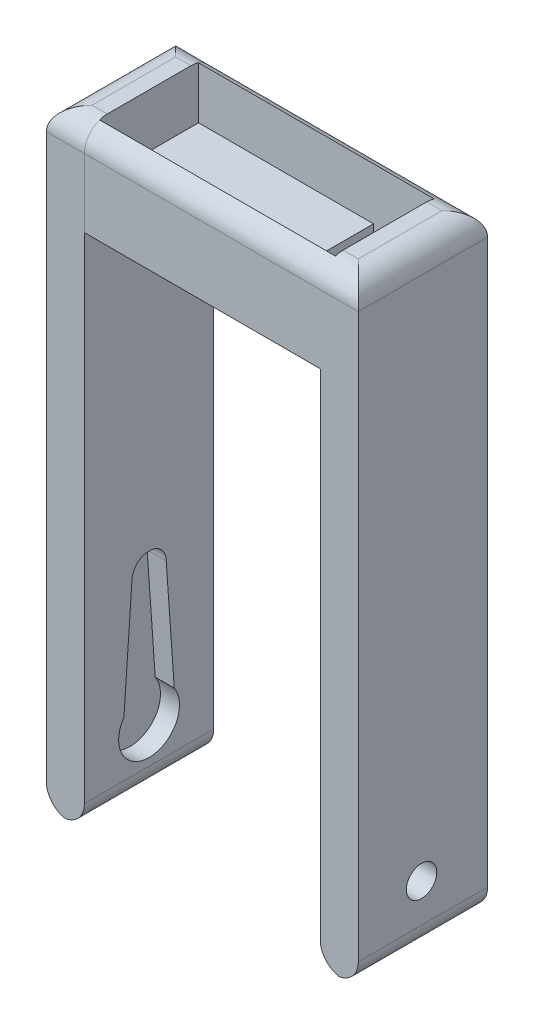
ISO-10303-21;
HEADER;
FILE_DESCRIPTION(('STEP AP214'),'2;1');
FILE_NAME('part.step','',(''),(''),'','','');
FILE_SCHEMA(('AUTOMOTIVE_DESIGN { 1 0 10303 214 1 1 1 1 }'));
ENDSEC;
DATA;
#1=APPLICATION_CONTEXT('core data for automotive mechanical design processes');
#2=APPLICATION_PROTOCOL_DEFINITION('international standard','automotive_design',2000,#1);
#3=PRODUCT_CONTEXT('',#1,'mechanical');
#4=PRODUCT('Part','Part','',(#3));
#5=PRODUCT_RELATED_PRODUCT_CATEGORY('part','',(#4));
#6=PRODUCT_DEFINITION_FORMATION('','',#4);
#7=PRODUCT_DEFINITION_CONTEXT('part definition',#1,'design');
#8=PRODUCT_DEFINITION('design','',#6,#7);
#9=PRODUCT_DEFINITION_SHAPE('','',#8);
#10=(LENGTH_UNIT() NAMED_UNIT(*) SI_UNIT(.MILLI.,.METRE.));
#11=(NAMED_UNIT(*) PLANE_ANGLE_UNIT() SI_UNIT($,.RADIAN.));
#12=(NAMED_UNIT(*) SI_UNIT($,.STERADIAN.) SOLID_ANGLE_UNIT());
#13=UNCERTAINTY_MEASURE_WITH_UNIT(LENGTH_MEASURE(1.E-05),#10,'distance_accuracy_value','');
#14=(GEOMETRIC_REPRESENTATION_CONTEXT(3) GLOBAL_UNCERTAINTY_ASSIGNED_CONTEXT((#13)) GLOBAL_UNIT_ASSIGNED_CONTEXT((#10,
#11,#12)) REPRESENTATION_CONTEXT('',''));
#15=CARTESIAN_POINT('',(0.,0.,0.));
#16=DIRECTION('',(0.,0.,1.));
#17=DIRECTION('',(1.,0.,0.));
#18=AXIS2_PLACEMENT_3D('',#15,#16,#17);
#19=CARTESIAN_POINT('',(-0.00200000000000894,73.,2.));
#20=DIRECTION('',(0.,-1.,0.));
#21=DIRECTION('',(0.,0.,-1.));
#22=AXIS2_PLACEMENT_3D('',#19,#20,#21);
#23=PLANE('',#22);
#24=DIRECTION('',(1.,0.,0.));
#25=VECTOR('',#24,1.);
#26=CARTESIAN_POINT('',(-0.00200000000000894,73.,2.));
#27=LINE('',#26,#25);
#28=CARTESIAN_POINT('',(31.,73.,1.99999999999999));
#29=VERTEX_POINT('',#28);
#30=CARTESIAN_POINT('',(36.,73.,1.99999999999998));
#31=VERTEX_POINT('',#30);
#32=EDGE_CURVE('E228',#29,#31,#27,.T.);
#33=ORIENTED_EDGE('',*,*,#32,.F.);
#34=DIRECTION('',(0.,0.,-1.));
#35=VECTOR('',#34,1.);
#36=CARTESIAN_POINT('',(31.,73.,15.));
#37=LINE('',#36,#35);
#38=CARTESIAN_POINT('',(31.,73.,15.));
#39=VERTEX_POINT('',#38);
#40=EDGE_CURVE('E186',#39,#29,#37,.T.);
#41=ORIENTED_EDGE('',*,*,#40,.F.);
#42=DIRECTION('',(1.,0.,0.));
#43=VECTOR('',#42,1.);
#44=CARTESIAN_POINT('',(-0.002000000000002,73.,15.));
#45=LINE('',#44,#43);
#46=CARTESIAN_POINT('',(36.,73.,15.));
#47=VERTEX_POINT('',#46);
#48=EDGE_CURVE('E231',#39,#47,#45,.T.);
#49=ORIENTED_EDGE('',*,*,#48,.T.);
#50=DIRECTION('',(0.,0.,-1.));
#51=VECTOR('',#50,1.);
#52=CARTESIAN_POINT('',(36.,73.,1.99999999999998));
#53=LINE('',#52,#51);
#54=EDGE_CURVE('E223',#47,#31,#53,.T.);
#55=ORIENTED_EDGE('',*,*,#54,.T.);
#56=EDGE_LOOP('',(#33,#41,#49,#55));
#57=FACE_BOUND('',#56,.T.);
#58=ADVANCED_FACE('F46',(#57),#23,.F.);
#59=CARTESIAN_POINT('',(36.,80.,0.));
#60=DIRECTION('',(1.,0.,0.));
#61=DIRECTION('',(0.,0.,-1.));
#62=AXIS2_PLACEMENT_3D('',#59,#60,#61);
#63=PLANE('',#62);
#64=DIRECTION('',(0.,-1.,0.));
#65=VECTOR('',#64,1.);
#66=CARTESIAN_POINT('',(36.,80.,15.));
#67=LINE('',#66,#65);
#68=CARTESIAN_POINT('',(36.,79.8284271247462,15.));
#69=VERTEX_POINT('',#68);
#70=EDGE_CURVE('E221',#69,#47,#67,.T.);
#71=ORIENTED_EDGE('',*,*,#70,.F.);
#72=CARTESIAN_POINT('',(36.,77.,14.));
#73=DIRECTION('',(1.,0.,0.));
#74=DIRECTION('',(0.,0.,-1.));
#75=AXIS2_PLACEMENT_3D('',#72,#73,#74);
#76=CIRCLE('',#75,3.);
#77=CARTESIAN_POINT('',(36.,80.,14.));
#78=VERTEX_POINT('',#77);
#79=EDGE_CURVE('E300',#69,#78,#76,.F.);
#80=ORIENTED_EDGE('',*,*,#79,.T.);
#81=DIRECTION('',(0.,0.,1.));
#82=VECTOR('',#81,1.);
#83=CARTESIAN_POINT('',(36.,80.,0.));
#84=LINE('',#83,#82);
#85=CARTESIAN_POINT('',(36.,80.,3.));
#86=VERTEX_POINT('',#85);
#87=EDGE_CURVE('E260',#86,#78,#84,.T.);
#88=ORIENTED_EDGE('',*,*,#87,.F.);
#89=CARTESIAN_POINT('',(36.,77.,3.));
#90=DIRECTION('',(1.,0.,0.));
#91=DIRECTION('',(0.,0.,-1.));
#92=AXIS2_PLACEMENT_3D('',#89,#90,#91);
#93=CIRCLE('',#92,3.);
#94=CARTESIAN_POINT('',(36.,79.8284271247462,2.00000000000001));
#95=VERTEX_POINT('',#94);
#96=EDGE_CURVE('E298',#86,#95,#93,.F.);
#97=ORIENTED_EDGE('',*,*,#96,.T.);
#98=DIRECTION('',(0.,1.,0.));
#99=VECTOR('',#98,1.);
#100=CARTESIAN_POINT('',(36.,80.,2.00000000000001));
#101=LINE('',#100,#99);
#102=EDGE_CURVE('E226',#31,#95,#101,.T.);
#103=ORIENTED_EDGE('',*,*,#102,.F.);
#104=ORIENTED_EDGE('',*,*,#54,.F.);
#105=EDGE_LOOP('',(#71,#80,#88,#97,#103,#104));
#106=FACE_BOUND('',#105,.T.);
#107=ADVANCED_FACE('F375',(#106),#63,.F.);
#108=CARTESIAN_POINT('',(36.,8.0419601084502,8.68637656111559));
#109=DIRECTION('',(-1.,0.,0.));
#110=DIRECTION('',(0.,0.,1.));
#111=AXIS2_PLACEMENT_3D('',#108,#109,#110);
#112=CIRCLE('',#111,2.);
#113=CARTESIAN_POINT('',(36.,8.0419601084502,10.6863765611156));
#114=VERTEX_POINT('',#113);
#115=EDGE_CURVE('E322',#114,#114,#112,.T.);
#116=ORIENTED_EDGE('',*,*,#115,.F.);
#117=EDGE_LOOP('',(#116));
#118=FACE_BOUND('',#117,.T.);
#119=DIRECTION('',(0.,-1.,0.));
#120=VECTOR('',#119,1.);
#121=CARTESIAN_POINT('',(36.,80.,0.));
#122=LINE('',#121,#120);
#123=CARTESIAN_POINT('',(36.,68.,0.));
#124=VERTEX_POINT('',#123);
#125=CARTESIAN_POINT('',(36.,3.,0.));
#126=VERTEX_POINT('',#125);
#127=EDGE_CURVE('E269',#124,#126,#122,.T.);
#128=ORIENTED_EDGE('',*,*,#127,.T.);
#129=DIRECTION('',(0.,0.,1.));
#130=VECTOR('',#129,1.);
#131=CARTESIAN_POINT('',(36.,3.,0.));
#132=LINE('',#131,#130);
#133=CARTESIAN_POINT('',(36.,3.,17.));
#134=VERTEX_POINT('',#133);
#135=EDGE_CURVE('E309',#126,#134,#132,.T.);
#136=ORIENTED_EDGE('',*,*,#135,.T.);
#137=DIRECTION('',(0.,-1.,0.));
#138=VECTOR('',#137,1.);
#139=CARTESIAN_POINT('',(36.,80.,17.));
#140=LINE('',#139,#138);
#141=CARTESIAN_POINT('',(36.,68.,17.));
#142=VERTEX_POINT('',#141);
#143=EDGE_CURVE('E276',#142,#134,#140,.T.);
#144=ORIENTED_EDGE('',*,*,#143,.F.);
#145=DIRECTION('',(0.,0.,1.));
#146=VECTOR('',#145,1.);
#147=CARTESIAN_POINT('',(36.,68.,0.));
#148=LINE('',#147,#146);
#149=EDGE_CURVE('E200',#124,#142,#148,.T.);
#150=ORIENTED_EDGE('',*,*,#149,.F.);
#151=EDGE_LOOP('',(#128,#136,#144,#150));
#152=FACE_BOUND('',#151,.T.);
#153=ADVANCED_FACE('F358',(#118,#152),#63,.F.);
#154=CARTESIAN_POINT('',(36.,80.,17.));
#155=DIRECTION('',(0.,0.,-1.));
#156=DIRECTION('',(-1.,0.,0.));
#157=AXIS2_PLACEMENT_3D('',#154,#155,#156);
#158=PLANE('',#157);
#159=DIRECTION('',(0.,1.,0.));
#160=VECTOR('',#159,1.);
#161=CARTESIAN_POINT('',(5.,72.,17.));
#162=LINE('',#161,#160);
#163=CARTESIAN_POINT('',(5.,68.,17.));
#164=VERTEX_POINT('',#163);
#165=CARTESIAN_POINT('',(5.,72.,17.));
#166=VERTEX_POINT('',#165);
#167=EDGE_CURVE('E250',#164,#166,#162,.T.);
#168=ORIENTED_EDGE('',*,*,#167,.F.);
#169=DIRECTION('',(1.,0.,0.));
#170=VECTOR('',#169,1.);
#171=CARTESIAN_POINT('',(-0.002000000000002,68.,17.));
#172=LINE('',#171,#170);
#173=EDGE_CURVE('E237',#164,#142,#172,.T.);
#174=ORIENTED_EDGE('',*,*,#173,.T.);
#175=ORIENTED_EDGE('',*,*,#143,.T.);
#176=CARTESIAN_POINT('',(39.,3.,17.));
#177=DIRECTION('',(0.,0.,-1.));
#178=DIRECTION('',(-1.,0.,0.));
#179=AXIS2_PLACEMENT_3D('',#176,#177,#178);
#180=CIRCLE('',#179,3.);
#181=CARTESIAN_POINT('',(38.5,0.041960108450196,17.));
#182=VERTEX_POINT('',#181);
#183=EDGE_CURVE('E288',#134,#182,#180,.F.);
#184=ORIENTED_EDGE('',*,*,#183,.T.);
#185=CARTESIAN_POINT('',(38.,3.,17.));
#186=DIRECTION('',(0.,0.,-1.));
#187=DIRECTION('',(-1.,0.,0.));
#188=AXIS2_PLACEMENT_3D('',#185,#186,#187);
#189=CIRCLE('',#188,3.);
#190=CARTESIAN_POINT('',(41.,3.,17.));
#191=VERTEX_POINT('',#190);
#192=EDGE_CURVE('E286',#182,#191,#189,.F.);
#193=ORIENTED_EDGE('',*,*,#192,.T.);
#194=DIRECTION('',(0.,-1.,0.));
#195=VECTOR('',#194,1.);
#196=CARTESIAN_POINT('',(41.,80.,17.));
#197=LINE('',#196,#195);
#198=CARTESIAN_POINT('',(41.,77.,17.));
#199=VERTEX_POINT('',#198);
#200=EDGE_CURVE('E274',#199,#191,#197,.T.);
#201=ORIENTED_EDGE('',*,*,#200,.F.);
#202=DIRECTION('',(1.,0.,0.));
#203=VECTOR('',#202,1.);
#204=CARTESIAN_POINT('',(5.,77.,17.));
#205=LINE('',#204,#203);
#206=CARTESIAN_POINT('',(5.,77.,17.));
#207=VERTEX_POINT('',#206);
#208=EDGE_CURVE('E290',#199,#207,#205,.F.);
#209=ORIENTED_EDGE('',*,*,#208,.T.);
#210=DIRECTION('',(0.,1.,0.));
#211=VECTOR('',#210,1.);
#212=CARTESIAN_POINT('',(5.,80.,17.));
#213=LINE('',#212,#211);
#214=EDGE_CURVE('E246',#166,#207,#213,.T.);
#215=ORIENTED_EDGE('',*,*,#214,.F.);
#216=EDGE_LOOP('',(#168,#174,#175,#184,#193,#201,#209,#215));
#217=FACE_BOUND('',#216,.T.);
#218=ADVANCED_FACE('F338',(#217),#158,.F.);
#219=CARTESIAN_POINT('',(41.,80.,0.));
#220=DIRECTION('',(-1.,0.,0.));
#221=DIRECTION('',(0.,0.,1.));
#222=AXIS2_PLACEMENT_3D('',#219,#220,#221);
#223=PLANE('',#222);
#224=CARTESIAN_POINT('',(41.,8.0419601084502,8.6863765611156));
#225=DIRECTION('',(-1.,0.,0.));
#226=DIRECTION('',(0.,0.,1.));
#227=AXIS2_PLACEMENT_3D('',#224,#225,#226);
#228=CIRCLE('',#227,2.);
#229=CARTESIAN_POINT('',(41.,8.0419601084502,10.6863765611156));
#230=VERTEX_POINT('',#229);
#231=EDGE_CURVE('E325',#230,#230,#228,.T.);
#232=ORIENTED_EDGE('',*,*,#231,.T.);
#233=EDGE_LOOP('',(#232));
#234=FACE_BOUND('',#233,.T.);
#235=ORIENTED_EDGE('',*,*,#200,.T.);
#236=DIRECTION('',(0.,0.,-1.));
#237=VECTOR('',#236,1.);
#238=CARTESIAN_POINT('',(41.,3.,0.));
#239=LINE('',#238,#237);
#240=CARTESIAN_POINT('',(41.,3.,0.));
#241=VERTEX_POINT('',#240);
#242=EDGE_CURVE('E12',#191,#241,#239,.T.);
#243=ORIENTED_EDGE('',*,*,#242,.T.);
#244=DIRECTION('',(0.,-1.,0.));
#245=VECTOR('',#244,1.);
#246=CARTESIAN_POINT('',(41.,80.,0.));
#247=LINE('',#246,#245);
#248=CARTESIAN_POINT('',(41.,77.,0.));
#249=VERTEX_POINT('',#248);
#250=EDGE_CURVE('E272',#249,#241,#247,.T.);
#251=ORIENTED_EDGE('',*,*,#250,.F.);
#252=DIRECTION('',(0.,0.,-1.));
#253=VECTOR('',#252,1.);
#254=CARTESIAN_POINT('',(41.,77.,17.));
#255=LINE('',#254,#253);
#256=EDGE_CURVE('E55',#249,#199,#255,.F.);
#257=ORIENTED_EDGE('',*,*,#256,.T.);
#258=EDGE_LOOP('',(#235,#243,#251,#257));
#259=FACE_BOUND('',#258,.T.);
#260=ADVANCED_FACE('F340',(#234,#259),#223,.F.);
#261=CARTESIAN_POINT('',(36.,80.,0.));
#262=DIRECTION('',(0.,0.,1.));
#263=DIRECTION('',(1.,0.,0.));
#264=AXIS2_PLACEMENT_3D('',#261,#262,#263);
#265=PLANE('',#264);
#266=DIRECTION('',(0.,-1.,0.));
#267=VECTOR('',#266,1.);
#268=CARTESIAN_POINT('',(5.,80.,0.));
#269=LINE('',#268,#267);
#270=CARTESIAN_POINT('',(5.,77.,0.));
#271=VERTEX_POINT('',#270);
#272=CARTESIAN_POINT('',(5.,72.,0.));
#273=VERTEX_POINT('',#272);
#274=EDGE_CURVE('E245',#271,#273,#269,.T.);
#275=ORIENTED_EDGE('',*,*,#274,.F.);
#276=DIRECTION('',(-1.,0.,0.));
#277=VECTOR('',#276,1.);
#278=CARTESIAN_POINT('',(41.,77.,0.));
#279=LINE('',#278,#277);
#280=EDGE_CURVE('E307',#271,#249,#279,.F.);
#281=ORIENTED_EDGE('',*,*,#280,.T.);
#282=ORIENTED_EDGE('',*,*,#250,.T.);
#283=CARTESIAN_POINT('',(38.,3.,0.));
#284=DIRECTION('',(0.,0.,1.));
#285=DIRECTION('',(1.,0.,0.));
#286=AXIS2_PLACEMENT_3D('',#283,#284,#285);
#287=CIRCLE('',#286,3.);
#288=CARTESIAN_POINT('',(38.5,0.041960108450196,0.));
#289=VERTEX_POINT('',#288);
#290=EDGE_CURVE('E63',#241,#289,#287,.F.);
#291=ORIENTED_EDGE('',*,*,#290,.T.);
#292=CARTESIAN_POINT('',(39.,3.,0.));
#293=DIRECTION('',(0.,0.,1.));
#294=DIRECTION('',(1.,0.,0.));
#295=AXIS2_PLACEMENT_3D('',#292,#293,#294);
#296=CIRCLE('',#295,3.);
#297=EDGE_CURVE('E305',#289,#126,#296,.F.);
#298=ORIENTED_EDGE('',*,*,#297,.T.);
#299=ORIENTED_EDGE('',*,*,#127,.F.);
#300=DIRECTION('',(1.,0.,0.));
#301=VECTOR('',#300,1.);
#302=CARTESIAN_POINT('',(-0.00200000000000894,68.,0.));
#303=LINE('',#302,#301);
#304=CARTESIAN_POINT('',(5.,68.,0.));
#305=VERTEX_POINT('',#304);
#306=EDGE_CURVE('E240',#305,#124,#303,.T.);
#307=ORIENTED_EDGE('',*,*,#306,.F.);
#308=DIRECTION('',(0.,-1.,0.));
#309=VECTOR('',#308,1.);
#310=CARTESIAN_POINT('',(5.,72.,0.));
#311=LINE('',#310,#309);
#312=EDGE_CURVE('E254',#273,#305,#311,.T.);
#313=ORIENTED_EDGE('',*,*,#312,.F.);
#314=EDGE_LOOP('',(#275,#281,#282,#291,#298,#299,#307,#313));
#315=FACE_BOUND('',#314,.T.);
#316=ADVANCED_FACE('F360',(#315),#265,.F.);
#317=CARTESIAN_POINT('',(0.,80.,0.));
#318=DIRECTION('',(0.,1.,0.));
#319=DIRECTION('',(0.,0.,1.));
#320=AXIS2_PLACEMENT_3D('',#317,#318,#319);
#321=PLANE('',#320);
#322=ORIENTED_EDGE('',*,*,#87,.T.);
#323=DIRECTION('',(1.,0.,0.));
#324=VECTOR('',#323,1.);
#325=CARTESIAN_POINT('',(41.,80.,14.));
#326=LINE('',#325,#324);
#327=CARTESIAN_POINT('',(38.,80.,14.));
#328=VERTEX_POINT('',#327);
#329=EDGE_CURVE('E283',#78,#328,#326,.T.);
#330=ORIENTED_EDGE('',*,*,#329,.T.);
#331=DIRECTION('',(0.,0.,-1.));
#332=VECTOR('',#331,1.);
#333=CARTESIAN_POINT('',(38.,80.,0.));
#334=LINE('',#333,#332);
#335=CARTESIAN_POINT('',(38.,80.,3.));
#336=VERTEX_POINT('',#335);
#337=EDGE_CURVE('E279',#328,#336,#334,.T.);
#338=ORIENTED_EDGE('',*,*,#337,.T.);
#339=DIRECTION('',(-1.,0.,0.));
#340=VECTOR('',#339,1.);
#341=CARTESIAN_POINT('',(5.,80.,3.));
#342=LINE('',#341,#340);
#343=EDGE_CURVE('E281',#336,#86,#342,.T.);
#344=ORIENTED_EDGE('',*,*,#343,.T.);
#345=EDGE_LOOP('',(#322,#330,#338,#344));
#346=FACE_BOUND('',#345,.T.);
#347=ADVANCED_FACE('F372',(#346),#321,.T.);
#348=CARTESIAN_POINT('',(5.,80.,0.));
#349=DIRECTION('',(-1.,0.,0.));
#350=DIRECTION('',(0.,0.,1.));
#351=AXIS2_PLACEMENT_3D('',#348,#349,#350);
#352=PLANE('',#351);
#353=ORIENTED_EDGE('',*,*,#214,.T.);
#354=CARTESIAN_POINT('',(5.,77.,14.));
#355=DIRECTION('',(-1.,0.,0.));
#356=DIRECTION('',(0.,0.,1.));
#357=AXIS2_PLACEMENT_3D('',#354,#355,#356);
#358=CIRCLE('',#357,3.);
#359=CARTESIAN_POINT('',(5.,79.8284271247462,15.));
#360=VERTEX_POINT('',#359);
#361=EDGE_CURVE('E294',#207,#360,#358,.T.);
#362=ORIENTED_EDGE('',*,*,#361,.T.);
#363=DIRECTION('',(0.,-1.,0.));
#364=VECTOR('',#363,1.);
#365=CARTESIAN_POINT('',(5.,80.,15.));
#366=LINE('',#365,#364);
#367=CARTESIAN_POINT('',(5.,73.,15.));
#368=VERTEX_POINT('',#367);
#369=EDGE_CURVE('E249',#360,#368,#366,.T.);
#370=ORIENTED_EDGE('',*,*,#369,.T.);
#371=DIRECTION('',(0.,0.,-1.));
#372=VECTOR('',#371,1.);
#373=CARTESIAN_POINT('',(5.,73.,2.));
#374=LINE('',#373,#372);
#375=CARTESIAN_POINT('',(5.,73.,2.));
#376=VERTEX_POINT('',#375);
#377=EDGE_CURVE('E261',#368,#376,#374,.T.);
#378=ORIENTED_EDGE('',*,*,#377,.T.);
#379=DIRECTION('',(0.,1.,0.));
#380=VECTOR('',#379,1.);
#381=CARTESIAN_POINT('',(5.,80.,2.00000000000003));
#382=LINE('',#381,#380);
#383=CARTESIAN_POINT('',(5.,79.8284271247462,2.00000000000003));
#384=VERTEX_POINT('',#383);
#385=EDGE_CURVE('E257',#376,#384,#382,.T.);
#386=ORIENTED_EDGE('',*,*,#385,.T.);
#387=CARTESIAN_POINT('',(5.,77.,3.));
#388=DIRECTION('',(-1.,0.,0.));
#389=DIRECTION('',(0.,0.,1.));
#390=AXIS2_PLACEMENT_3D('',#387,#388,#389);
#391=CIRCLE('',#390,3.);
#392=EDGE_CURVE('E292',#384,#271,#391,.T.);
#393=ORIENTED_EDGE('',*,*,#392,.T.);
#394=ORIENTED_EDGE('',*,*,#274,.T.);
#395=ORIENTED_EDGE('',*,*,#312,.T.);
#396=DIRECTION('',(0.,0.,1.));
#397=VECTOR('',#396,1.);
#398=CARTESIAN_POINT('',(5.,68.,0.));
#399=LINE('',#398,#397);
#400=EDGE_CURVE('E253',#305,#164,#399,.T.);
#401=ORIENTED_EDGE('',*,*,#400,.T.);
#402=ORIENTED_EDGE('',*,*,#167,.T.);
#403=EDGE_LOOP('',(#353,#362,#370,#378,#386,#393,#394,#395,#401,#402));
#404=FACE_BOUND('',#403,.T.);
#405=ADVANCED_FACE('F350',(#404),#352,.T.);
#406=CARTESIAN_POINT('',(-0.00200000000000894,68.,0.));
#407=DIRECTION('',(0.,1.,0.));
#408=DIRECTION('',(0.,0.,1.));
#409=AXIS2_PLACEMENT_3D('',#406,#407,#408);
#410=PLANE('',#409);
#411=DIRECTION('',(-1.,0.,0.));
#412=VECTOR('',#411,1.);
#413=CARTESIAN_POINT('',(31.,68.,15.));
#414=LINE('',#413,#412);
#415=CARTESIAN_POINT('',(31.,68.,15.));
#416=VERTEX_POINT('',#415);
#417=CARTESIAN_POINT('',(28.,68.,15.));
#418=VERTEX_POINT('',#417);
#419=EDGE_CURVE('E206',#416,#418,#414,.T.);
#420=ORIENTED_EDGE('',*,*,#419,.F.);
#421=DIRECTION('',(0.,0.,1.));
#422=VECTOR('',#421,1.);
#423=CARTESIAN_POINT('',(31.,68.,15.));
#424=LINE('',#423,#422);
#425=CARTESIAN_POINT('',(31.,68.,2.00000000000001));
#426=VERTEX_POINT('',#425);
#427=EDGE_CURVE('E183',#426,#416,#424,.T.);
#428=ORIENTED_EDGE('',*,*,#427,.F.);
#429=DIRECTION('',(1.,0.,0.));
#430=VECTOR('',#429,1.);
#431=CARTESIAN_POINT('',(31.,68.,2.00000000000001));
#432=LINE('',#431,#430);
#433=CARTESIAN_POINT('',(28.,68.,2.00000000000001));
#434=VERTEX_POINT('',#433);
#435=EDGE_CURVE('E194',#434,#426,#432,.T.);
#436=ORIENTED_EDGE('',*,*,#435,.F.);
#437=DIRECTION('',(0.,0.,-1.));
#438=VECTOR('',#437,1.);
#439=CARTESIAN_POINT('',(28.,68.,15.));
#440=LINE('',#439,#438);
#441=EDGE_CURVE('E209',#418,#434,#440,.T.);
#442=ORIENTED_EDGE('',*,*,#441,.F.);
#443=EDGE_LOOP('',(#420,#428,#436,#442));
#444=FACE_BOUND('',#443,.T.);
#445=ORIENTED_EDGE('',*,*,#400,.F.);
#446=ORIENTED_EDGE('',*,*,#306,.T.);
#447=ORIENTED_EDGE('',*,*,#149,.T.);
#448=ORIENTED_EDGE('',*,*,#173,.F.);
#449=EDGE_LOOP('',(#445,#446,#447,#448));
#450=FACE_BOUND('',#449,.T.);
#451=ADVANCED_FACE('F203',(#444,#450),#410,.F.);
#452=CARTESIAN_POINT('',(-0.002000000000002,80.,15.));
#453=DIRECTION('',(0.,0.,1.));
#454=DIRECTION('',(0.,-1.,0.));
#455=AXIS2_PLACEMENT_3D('',#452,#453,#454);
#456=PLANE('',#455);
#457=ORIENTED_EDGE('',*,*,#369,.F.);
#458=DIRECTION('',(-1.,0.,0.));
#459=VECTOR('',#458,1.);
#460=CARTESIAN_POINT('',(5.,79.8284271247462,15.));
#461=LINE('',#460,#459);
#462=EDGE_CURVE('E296',#360,#69,#461,.F.);
#463=ORIENTED_EDGE('',*,*,#462,.T.);
#464=ORIENTED_EDGE('',*,*,#70,.T.);
#465=ORIENTED_EDGE('',*,*,#48,.F.);
#466=DIRECTION('',(0.,1.,0.));
#467=VECTOR('',#466,1.);
#468=CARTESIAN_POINT('',(31.,-0.001000000000001,15.));
#469=LINE('',#468,#467);
#470=EDGE_CURVE('E201',#416,#39,#469,.T.);
#471=ORIENTED_EDGE('',*,*,#470,.F.);
#472=ORIENTED_EDGE('',*,*,#419,.T.);
#473=DIRECTION('',(0.,1.,0.));
#474=VECTOR('',#473,1.);
#475=CARTESIAN_POINT('',(28.,-0.001000000000001,15.));
#476=LINE('',#475,#474);
#477=CARTESIAN_POINT('',(28.,73.,15.));
#478=VERTEX_POINT('',#477);
#479=EDGE_CURVE('E216',#418,#478,#476,.T.);
#480=ORIENTED_EDGE('',*,*,#479,.T.);
#481=EDGE_CURVE('E232',#368,#478,#45,.T.);
#482=ORIENTED_EDGE('',*,*,#481,.F.);
#483=EDGE_LOOP('',(#457,#463,#464,#465,#471,#472,#480,#482));
#484=FACE_BOUND('',#483,.T.);
#485=ADVANCED_FACE('F379',(#484),#456,.F.);
#486=ORIENTED_EDGE('',*,*,#481,.T.);
#487=DIRECTION('',(0.,0.,1.));
#488=VECTOR('',#487,1.);
#489=CARTESIAN_POINT('',(28.,73.,15.));
#490=LINE('',#489,#488);
#491=CARTESIAN_POINT('',(28.,73.,2.00000000000001));
#492=VERTEX_POINT('',#491);
#493=EDGE_CURVE('E190',#492,#478,#490,.T.);
#494=ORIENTED_EDGE('',*,*,#493,.F.);
#495=EDGE_CURVE('E229',#376,#492,#27,.T.);
#496=ORIENTED_EDGE('',*,*,#495,.F.);
#497=ORIENTED_EDGE('',*,*,#377,.F.);
#498=EDGE_LOOP('',(#486,#494,#496,#497));
#499=FACE_BOUND('',#498,.T.);
#500=ADVANCED_FACE('F386',(#499),#23,.F.);
#501=CARTESIAN_POINT('',(-0.00200000000000894,80.,2.00000000000003));
#502=DIRECTION('',(0.,0.,-1.));
#503=DIRECTION('',(0.,1.,0.));
#504=AXIS2_PLACEMENT_3D('',#501,#502,#503);
#505=PLANE('',#504);
#506=ORIENTED_EDGE('',*,*,#102,.T.);
#507=DIRECTION('',(1.,0.,0.));
#508=VECTOR('',#507,1.);
#509=CARTESIAN_POINT('',(36.,79.8284271247462,2.00000000000001));
#510=LINE('',#509,#508);
#511=EDGE_CURVE('E302',#95,#384,#510,.F.);
#512=ORIENTED_EDGE('',*,*,#511,.T.);
#513=ORIENTED_EDGE('',*,*,#385,.F.);
#514=ORIENTED_EDGE('',*,*,#495,.T.);
#515=DIRECTION('',(0.,1.,0.));
#516=VECTOR('',#515,1.);
#517=CARTESIAN_POINT('',(28.,-0.001000000000001,2.00000000000001));
#518=LINE('',#517,#516);
#519=EDGE_CURVE('E189',#434,#492,#518,.T.);
#520=ORIENTED_EDGE('',*,*,#519,.F.);
#521=ORIENTED_EDGE('',*,*,#435,.T.);
#522=DIRECTION('',(0.,1.,0.));
#523=VECTOR('',#522,1.);
#524=CARTESIAN_POINT('',(31.,-0.001000000000001,2.00000000000001));
#525=LINE('',#524,#523);
#526=EDGE_CURVE('E179',#426,#29,#525,.T.);
#527=ORIENTED_EDGE('',*,*,#526,.T.);
#528=ORIENTED_EDGE('',*,*,#32,.T.);
#529=EDGE_LOOP('',(#506,#512,#513,#514,#520,#521,#527,#528));
#530=FACE_BOUND('',#529,.T.);
#531=ADVANCED_FACE('F196',(#530),#505,.F.);
#532=CARTESIAN_POINT('',(31.,-0.001000000000001,15.));
#533=DIRECTION('',(1.,0.,0.));
#534=DIRECTION('',(0.,0.,-1.));
#535=AXIS2_PLACEMENT_3D('',#532,#533,#534);
#536=PLANE('',#535);
#537=ORIENTED_EDGE('',*,*,#427,.T.);
#538=ORIENTED_EDGE('',*,*,#470,.T.);
#539=ORIENTED_EDGE('',*,*,#40,.T.);
#540=ORIENTED_EDGE('',*,*,#526,.F.);
#541=EDGE_LOOP('',(#537,#538,#539,#540));
#542=FACE_BOUND('',#541,.T.);
#543=ADVANCED_FACE('F181',(#542),#536,.F.);
#544=CARTESIAN_POINT('',(28.,-0.001000000000001,15.));
#545=DIRECTION('',(-1.,0.,0.));
#546=DIRECTION('',(0.,0.,1.));
#547=AXIS2_PLACEMENT_3D('',#544,#545,#546);
#548=PLANE('',#547);
#549=ORIENTED_EDGE('',*,*,#441,.T.);
#550=ORIENTED_EDGE('',*,*,#519,.T.);
#551=ORIENTED_EDGE('',*,*,#493,.T.);
#552=ORIENTED_EDGE('',*,*,#479,.F.);
#553=EDGE_LOOP('',(#549,#550,#551,#552));
#554=FACE_BOUND('',#553,.T.);
#555=ADVANCED_FACE('F389',(#554),#548,.F.);
#556=CARTESIAN_POINT('',(0.,77.,3.));
#557=DIRECTION('',(1.,0.,0.));
#558=DIRECTION('',(0.,0.,-1.));
#559=AXIS2_PLACEMENT_3D('',#556,#557,#558);
#560=CYLINDRICAL_SURFACE('',#559,3.);
#561=ORIENTED_EDGE('',*,*,#96,.F.);
#562=ORIENTED_EDGE('',*,*,#343,.F.);
#563=CARTESIAN_POINT('',(38.,77.,3.));
#564=DIRECTION('',(0.707106781186547,0.,0.707106781186547));
#565=DIRECTION('',(-0.707106781186547,0.,0.707106781186547));
#566=AXIS2_PLACEMENT_3D('',#563,#564,#565);
#567=ELLIPSE('',#566,4.24264068711928,3.);
#568=EDGE_CURVE('E314',#249,#336,#567,.T.);
#569=ORIENTED_EDGE('',*,*,#568,.F.);
#570=ORIENTED_EDGE('',*,*,#280,.F.);
#571=ORIENTED_EDGE('',*,*,#392,.F.);
#572=ORIENTED_EDGE('',*,*,#511,.F.);
#573=EDGE_LOOP('',(#561,#562,#569,#570,#571,#572));
#574=FACE_BOUND('',#573,.T.);
#575=ADVANCED_FACE('F367',(#574),#560,.T.);
#576=CARTESIAN_POINT('',(38.,77.,0.));
#577=DIRECTION('',(0.,0.,1.));
#578=DIRECTION('',(1.,0.,0.));
#579=AXIS2_PLACEMENT_3D('',#576,#577,#578);
#580=CYLINDRICAL_SURFACE('',#579,3.);
#581=ORIENTED_EDGE('',*,*,#568,.T.);
#582=ORIENTED_EDGE('',*,*,#337,.F.);
#583=CARTESIAN_POINT('',(38.,77.,14.));
#584=DIRECTION('',(-0.707106781186547,0.,0.707106781186547));
#585=DIRECTION('',(0.707106781186547,0.,0.707106781186547));
#586=AXIS2_PLACEMENT_3D('',#583,#584,#585);
#587=ELLIPSE('',#586,4.24264068711928,3.);
#588=EDGE_CURVE('E313',#199,#328,#587,.T.);
#589=ORIENTED_EDGE('',*,*,#588,.F.);
#590=ORIENTED_EDGE('',*,*,#256,.F.);
#591=EDGE_LOOP('',(#581,#582,#589,#590));
#592=FACE_BOUND('',#591,.T.);
#593=ADVANCED_FACE('F342',(#592),#580,.T.);
#594=CARTESIAN_POINT('',(0.,77.,14.));
#595=DIRECTION('',(-1.,0.,0.));
#596=DIRECTION('',(0.,0.,1.));
#597=AXIS2_PLACEMENT_3D('',#594,#595,#596);
#598=CYLINDRICAL_SURFACE('',#597,3.);
#599=ORIENTED_EDGE('',*,*,#361,.F.);
#600=ORIENTED_EDGE('',*,*,#208,.F.);
#601=ORIENTED_EDGE('',*,*,#588,.T.);
#602=ORIENTED_EDGE('',*,*,#329,.F.);
#603=ORIENTED_EDGE('',*,*,#79,.F.);
#604=ORIENTED_EDGE('',*,*,#462,.F.);
#605=EDGE_LOOP('',(#599,#600,#601,#602,#603,#604));
#606=FACE_BOUND('',#605,.T.);
#607=ADVANCED_FACE('F346',(#606),#598,.T.);
#608=CARTESIAN_POINT('',(38.,3.,0.));
#609=DIRECTION('',(0.,0.,-1.));
#610=DIRECTION('',(-1.,0.,0.));
#611=AXIS2_PLACEMENT_3D('',#608,#609,#610);
#612=CYLINDRICAL_SURFACE('',#611,3.);
#613=DIRECTION('',(0.,0.,-1.));
#614=VECTOR('',#613,1.);
#615=CARTESIAN_POINT('',(38.5,0.0419601084501947,8.5));
#616=LINE('',#615,#614);
#617=EDGE_CURVE('E50',#289,#182,#616,.F.);
#618=ORIENTED_EDGE('',*,*,#617,.F.);
#619=ORIENTED_EDGE('',*,*,#290,.F.);
#620=ORIENTED_EDGE('',*,*,#242,.F.);
#621=ORIENTED_EDGE('',*,*,#192,.F.);
#622=EDGE_LOOP('',(#618,#619,#620,#621));
#623=FACE_BOUND('',#622,.T.);
#624=ADVANCED_FACE('F48',(#623),#612,.T.);
#625=CARTESIAN_POINT('',(39.,3.,0.));
#626=DIRECTION('',(0.,0.,1.));
#627=DIRECTION('',(1.,0.,0.));
#628=AXIS2_PLACEMENT_3D('',#625,#626,#627);
#629=CYLINDRICAL_SURFACE('',#628,3.);
#630=ORIENTED_EDGE('',*,*,#297,.F.);
#631=ORIENTED_EDGE('',*,*,#617,.T.);
#632=ORIENTED_EDGE('',*,*,#183,.F.);
#633=ORIENTED_EDGE('',*,*,#135,.F.);
#634=EDGE_LOOP('',(#630,#631,#632,#633));
#635=FACE_BOUND('',#634,.T.);
#636=ADVANCED_FACE('F332',(#635),#629,.T.);
#637=CARTESIAN_POINT('',(41.,8.0419601084502,8.6863765611156));
#638=DIRECTION('',(-1.,0.,0.));
#639=DIRECTION('',(0.,0.,1.));
#640=AXIS2_PLACEMENT_3D('',#637,#638,#639);
#641=CYLINDRICAL_SURFACE('',#640,2.);
#642=ORIENTED_EDGE('',*,*,#231,.F.);
#643=EDGE_LOOP('',(#642));
#644=FACE_BOUND('',#643,.T.);
#645=ORIENTED_EDGE('',*,*,#115,.T.);
#646=EDGE_LOOP('',(#645));
#647=FACE_BOUND('',#646,.T.);
#648=ADVANCED_FACE('F431',(#644,#647),#641,.F.);
#649=CLOSED_SHELL('',(#58,#107,#153,#218,#260,#316,#347,#405,#451,#485,#500,#531,#543,#555,#575,
#593,#607,#624,#636,#648));
#650=MANIFOLD_SOLID_BREP('B2',#649);
#651=CARTESIAN_POINT('',(5.,80.,0.));
#652=DIRECTION('',(-1.,0.,0.));
#653=DIRECTION('',(0.,0.,1.));
#654=AXIS2_PLACEMENT_3D('',#651,#652,#653);
#655=PLANE('',#654);
#656=DIRECTION('',(0.,-1.,0.));
#657=VECTOR('',#656,1.);
#658=CARTESIAN_POINT('',(5.,80.,17.));
#659=LINE('',#658,#657);
#660=CARTESIAN_POINT('',(5.,77.,17.));
#661=VERTEX_POINT('',#660);
#662=CARTESIAN_POINT('',(5.,3.,17.));
#663=VERTEX_POINT('',#662);
#664=EDGE_CURVE('E712',#661,#663,#659,.T.);
#665=ORIENTED_EDGE('',*,*,#664,.T.);
#666=DIRECTION('',(0.,0.,-1.));
#667=VECTOR('',#666,1.);
#668=CARTESIAN_POINT('',(5.,3.,0.));
#669=LINE('',#668,#667);
#670=CARTESIAN_POINT('',(5.,3.,0.));
#671=VERTEX_POINT('',#670);
#672=EDGE_CURVE('E739',#663,#671,#669,.T.);
#673=ORIENTED_EDGE('',*,*,#672,.T.);
#674=DIRECTION('',(0.,-1.,0.));
#675=VECTOR('',#674,1.);
#676=CARTESIAN_POINT('',(5.,80.,0.));
#677=LINE('',#676,#675);
#678=CARTESIAN_POINT('',(5.,77.,0.));
#679=VERTEX_POINT('',#678);
#680=EDGE_CURVE('E709',#679,#671,#677,.T.);
#681=ORIENTED_EDGE('',*,*,#680,.F.);
#682=CARTESIAN_POINT('',(5.,77.,3.));
#683=DIRECTION('',(-1.,0.,0.));
#684=DIRECTION('',(0.,0.,1.));
#685=AXIS2_PLACEMENT_3D('',#682,#683,#684);
#686=CIRCLE('',#685,3.);
#687=CARTESIAN_POINT('',(5.,80.,3.));
#688=VERTEX_POINT('',#687);
#689=EDGE_CURVE('E735',#679,#688,#686,.F.);
#690=ORIENTED_EDGE('',*,*,#689,.T.);
#691=DIRECTION('',(0.,0.,-1.));
#692=VECTOR('',#691,1.);
#693=CARTESIAN_POINT('',(5.,80.,0.));
#694=LINE('',#693,#692);
#695=CARTESIAN_POINT('',(5.,80.,14.));
#696=VERTEX_POINT('',#695);
#697=EDGE_CURVE('E701',#696,#688,#694,.T.);
#698=ORIENTED_EDGE('',*,*,#697,.F.);
#699=CARTESIAN_POINT('',(5.,77.,14.));
#700=DIRECTION('',(-1.,0.,0.));
#701=DIRECTION('',(0.,0.,1.));
#702=AXIS2_PLACEMENT_3D('',#699,#700,#701);
#703=CIRCLE('',#702,3.);
#704=EDGE_CURVE('E737',#696,#661,#703,.F.);
#705=ORIENTED_EDGE('',*,*,#704,.T.);
#706=EDGE_LOOP('',(#665,#673,#681,#690,#698,#705));
#707=FACE_BOUND('',#706,.T.);
#708=CARTESIAN_POINT('',(5.,25.2677997154365,8.5));
#709=DIRECTION('',(1.,0.,0.));
#710=DIRECTION('',(0.,0.,-1.));
#711=AXIS2_PLACEMENT_3D('',#708,#709,#710);
#712=CIRCLE('',#711,2.25);
#713=CARTESIAN_POINT('',(5.,25.2677997154365,10.75));
#714=VERTEX_POINT('',#713);
#715=CARTESIAN_POINT('',(5.,25.2677997154365,6.25));
#716=VERTEX_POINT('',#715);
#717=EDGE_CURVE('E679',#714,#716,#712,.F.);
#718=ORIENTED_EDGE('',*,*,#717,.T.);
#719=DIRECTION('',(0.,0.997531391051944,0.0702219614221419));
#720=VECTOR('',#719,1.);
#721=CARTESIAN_POINT('',(5.,-0.313205167656498,4.44920620628706));
#722=LINE('',#721,#720);
#723=CARTESIAN_POINT('',(5.,10.25,5.19281086116926));
#724=VERTEX_POINT('',#723);
#725=EDGE_CURVE('E685',#724,#716,#722,.T.);
#726=ORIENTED_EDGE('',*,*,#725,.F.);
#727=CARTESIAN_POINT('',(5.,8.,8.5));
#728=DIRECTION('',(1.,0.,0.));
#729=DIRECTION('',(0.,0.,-1.));
#730=AXIS2_PLACEMENT_3D('',#727,#728,#729);
#731=CIRCLE('',#730,4.);
#732=CARTESIAN_POINT('',(5.,10.25,11.8071891388307));
#733=VERTEX_POINT('',#732);
#734=EDGE_CURVE('E688',#733,#724,#731,.T.);
#735=ORIENTED_EDGE('',*,*,#734,.F.);
#736=DIRECTION('',(0.,0.997531391051944,-0.0702219614221418));
#737=VECTOR('',#736,1.);
#738=CARTESIAN_POINT('',(5.,0.877621216960529,12.4669646879914));
#739=LINE('',#738,#737);
#740=EDGE_CURVE('E694',#733,#714,#739,.T.);
#741=ORIENTED_EDGE('',*,*,#740,.T.);
#742=EDGE_LOOP('',(#718,#726,#735,#741));
#743=FACE_BOUND('',#742,.T.);
#744=ADVANCED_FACE('F577',(#707,#743),#655,.F.);
#745=CARTESIAN_POINT('',(0.,80.,0.));
#746=DIRECTION('',(1.,0.,0.));
#747=DIRECTION('',(0.,0.,-1.));
#748=AXIS2_PLACEMENT_3D('',#745,#746,#747);
#749=PLANE('',#748);
#750=DIRECTION('',(0.,-1.,0.));
#751=VECTOR('',#750,1.);
#752=CARTESIAN_POINT('',(0.,80.,0.));
#753=LINE('',#752,#751);
#754=CARTESIAN_POINT('',(0.,77.,0.));
#755=VERTEX_POINT('',#754);
#756=CARTESIAN_POINT('',(0.,3.,0.));
#757=VERTEX_POINT('',#756);
#758=EDGE_CURVE('E706',#755,#757,#753,.T.);
#759=ORIENTED_EDGE('',*,*,#758,.T.);
#760=DIRECTION('',(0.,0.,1.));
#761=VECTOR('',#760,1.);
#762=CARTESIAN_POINT('',(0.,3.,0.));
#763=LINE('',#762,#761);
#764=CARTESIAN_POINT('',(0.,3.,17.));
#765=VERTEX_POINT('',#764);
#766=EDGE_CURVE('E720',#757,#765,#763,.T.);
#767=ORIENTED_EDGE('',*,*,#766,.T.);
#768=DIRECTION('',(0.,-1.,0.));
#769=VECTOR('',#768,1.);
#770=CARTESIAN_POINT('',(0.,80.,17.));
#771=LINE('',#770,#769);
#772=CARTESIAN_POINT('',(0.,77.,17.));
#773=VERTEX_POINT('',#772);
#774=EDGE_CURVE('E715',#773,#765,#771,.T.);
#775=ORIENTED_EDGE('',*,*,#774,.F.);
#776=DIRECTION('',(0.,0.,1.));
#777=VECTOR('',#776,1.);
#778=CARTESIAN_POINT('',(0.,77.,0.));
#779=LINE('',#778,#777);
#780=EDGE_CURVE('E718',#773,#755,#779,.F.);
#781=ORIENTED_EDGE('',*,*,#780,.T.);
#782=EDGE_LOOP('',(#759,#767,#775,#781));
#783=FACE_BOUND('',#782,.T.);
#784=ADVANCED_FACE('F774',(#783),#749,.F.);
#785=CARTESIAN_POINT('',(0.,80.,17.));
#786=DIRECTION('',(0.,0.,-1.));
#787=DIRECTION('',(-1.,0.,0.));
#788=AXIS2_PLACEMENT_3D('',#785,#786,#787);
#789=PLANE('',#788);
#790=ORIENTED_EDGE('',*,*,#774,.T.);
#791=CARTESIAN_POINT('',(3.,3.,17.));
#792=DIRECTION('',(0.,0.,-1.));
#793=DIRECTION('',(-1.,0.,0.));
#794=AXIS2_PLACEMENT_3D('',#791,#792,#793);
#795=CIRCLE('',#794,3.);
#796=CARTESIAN_POINT('',(2.5,0.0419601084501943,17.));
#797=VERTEX_POINT('',#796);
#798=EDGE_CURVE('E727',#765,#797,#795,.F.);
#799=ORIENTED_EDGE('',*,*,#798,.T.);
#800=CARTESIAN_POINT('',(2.,3.,17.));
#801=DIRECTION('',(0.,0.,-1.));
#802=DIRECTION('',(-1.,0.,0.));
#803=AXIS2_PLACEMENT_3D('',#800,#801,#802);
#804=CIRCLE('',#803,3.);
#805=EDGE_CURVE('E725',#797,#663,#804,.F.);
#806=ORIENTED_EDGE('',*,*,#805,.T.);
#807=ORIENTED_EDGE('',*,*,#664,.F.);
#808=DIRECTION('',(1.,0.,0.));
#809=VECTOR('',#808,1.);
#810=CARTESIAN_POINT('',(0.,77.,17.));
#811=LINE('',#810,#809);
#812=EDGE_CURVE('E723',#661,#773,#811,.F.);
#813=ORIENTED_EDGE('',*,*,#812,.T.);
#814=EDGE_LOOP('',(#790,#799,#806,#807,#813));
#815=FACE_BOUND('',#814,.T.);
#816=ADVANCED_FACE('F778',(#815),#789,.F.);
#817=CARTESIAN_POINT('',(0.,80.,0.));
#818=DIRECTION('',(0.,0.,1.));
#819=DIRECTION('',(1.,0.,0.));
#820=AXIS2_PLACEMENT_3D('',#817,#818,#819);
#821=PLANE('',#820);
#822=CARTESIAN_POINT('',(2.,3.,0.));
#823=DIRECTION('',(0.,0.,1.));
#824=DIRECTION('',(1.,0.,0.));
#825=AXIS2_PLACEMENT_3D('',#822,#823,#824);
#826=CIRCLE('',#825,3.);
#827=CARTESIAN_POINT('',(2.5,0.0419601084501947,0.));
#828=VERTEX_POINT('',#827);
#829=EDGE_CURVE('E731',#671,#828,#826,.F.);
#830=ORIENTED_EDGE('',*,*,#829,.T.);
#831=CARTESIAN_POINT('',(3.,3.,0.));
#832=DIRECTION('',(0.,0.,1.));
#833=DIRECTION('',(1.,0.,0.));
#834=AXIS2_PLACEMENT_3D('',#831,#832,#833);
#835=CIRCLE('',#834,3.);
#836=EDGE_CURVE('E733',#828,#757,#835,.F.);
#837=ORIENTED_EDGE('',*,*,#836,.T.);
#838=ORIENTED_EDGE('',*,*,#758,.F.);
#839=DIRECTION('',(-1.,0.,0.));
#840=VECTOR('',#839,1.);
#841=CARTESIAN_POINT('',(5.,77.,0.));
#842=LINE('',#841,#840);
#843=EDGE_CURVE('E729',#755,#679,#842,.F.);
#844=ORIENTED_EDGE('',*,*,#843,.T.);
#845=ORIENTED_EDGE('',*,*,#680,.T.);
#846=EDGE_LOOP('',(#830,#837,#838,#844,#845));
#847=FACE_BOUND('',#846,.T.);
#848=ADVANCED_FACE('F759',(#847),#821,.F.);
#849=CARTESIAN_POINT('',(0.,80.,0.));
#850=DIRECTION('',(0.,1.,0.));
#851=DIRECTION('',(0.,0.,1.));
#852=AXIS2_PLACEMENT_3D('',#849,#850,#851);
#853=PLANE('',#852);
#854=DIRECTION('',(0.,0.,1.));
#855=VECTOR('',#854,1.);
#856=CARTESIAN_POINT('',(3.,80.,17.));
#857=LINE('',#856,#855);
#858=CARTESIAN_POINT('',(3.,80.,3.));
#859=VERTEX_POINT('',#858);
#860=CARTESIAN_POINT('',(3.,80.,14.));
#861=VERTEX_POINT('',#860);
#862=EDGE_CURVE('E586',#859,#861,#857,.T.);
#863=ORIENTED_EDGE('',*,*,#862,.T.);
#864=DIRECTION('',(1.,0.,0.));
#865=VECTOR('',#864,1.);
#866=CARTESIAN_POINT('',(5.,80.,14.));
#867=LINE('',#866,#865);
#868=EDGE_CURVE('E44',#861,#696,#867,.T.);
#869=ORIENTED_EDGE('',*,*,#868,.T.);
#870=ORIENTED_EDGE('',*,*,#697,.T.);
#871=DIRECTION('',(-1.,0.,0.));
#872=VECTOR('',#871,1.);
#873=CARTESIAN_POINT('',(0.,80.,3.));
#874=LINE('',#873,#872);
#875=EDGE_CURVE('E597',#688,#859,#874,.T.);
#876=ORIENTED_EDGE('',*,*,#875,.T.);
#877=EDGE_LOOP('',(#863,#869,#870,#876));
#878=FACE_BOUND('',#877,.T.);
#879=ADVANCED_FACE('F780',(#878),#853,.T.);
#880=CARTESIAN_POINT('',(2.5,25.2677997154365,8.5));
#881=DIRECTION('',(1.,0.,0.));
#882=DIRECTION('',(0.,0.,-1.));
#883=AXIS2_PLACEMENT_3D('',#880,#881,#882);
#884=CYLINDRICAL_SURFACE('',#883,2.25);
#885=ORIENTED_EDGE('',*,*,#717,.F.);
#886=DIRECTION('',(1.,0.,0.));
#887=VECTOR('',#886,1.);
#888=CARTESIAN_POINT('',(2.5,25.2677997154365,10.75));
#889=LINE('',#888,#887);
#890=CARTESIAN_POINT('',(2.5,25.2677997154365,10.75));
#891=VERTEX_POINT('',#890);
#892=EDGE_CURVE('E665',#891,#714,#889,.T.);
#893=ORIENTED_EDGE('',*,*,#892,.F.);
#894=CARTESIAN_POINT('',(2.5,25.2677997154365,8.5));
#895=DIRECTION('',(1.,0.,0.));
#896=DIRECTION('',(0.,0.,-1.));
#897=AXIS2_PLACEMENT_3D('',#894,#895,#896);
#898=CIRCLE('',#897,2.25);
#899=CARTESIAN_POINT('',(2.5,25.2677997154365,6.25));
#900=VERTEX_POINT('',#899);
#901=EDGE_CURVE('E673',#891,#900,#898,.F.);
#902=ORIENTED_EDGE('',*,*,#901,.T.);
#903=DIRECTION('',(1.,0.,0.));
#904=VECTOR('',#903,1.);
#905=CARTESIAN_POINT('',(2.5,25.2677997154365,6.25));
#906=LINE('',#905,#904);
#907=EDGE_CURVE('E699',#900,#716,#906,.T.);
#908=ORIENTED_EDGE('',*,*,#907,.T.);
#909=EDGE_LOOP('',(#885,#893,#902,#908));
#910=FACE_BOUND('',#909,.T.);
#911=ADVANCED_FACE('F676',(#910),#884,.F.);
#912=CARTESIAN_POINT('',(2.5,-0.313205167656498,4.44920620628706));
#913=DIRECTION('',(0.,0.0702219614221419,-0.997531391051944));
#914=DIRECTION('',(0.,0.997531391051944,0.0702219614221419));
#915=AXIS2_PLACEMENT_3D('',#912,#913,#914);
#916=PLANE('',#915);
#917=ORIENTED_EDGE('',*,*,#725,.T.);
#918=ORIENTED_EDGE('',*,*,#907,.F.);
#919=DIRECTION('',(0.,0.997531391051944,0.0702219614221419));
#920=VECTOR('',#919,1.);
#921=CARTESIAN_POINT('',(2.5,-0.313205167656498,4.44920620628706));
#922=LINE('',#921,#920);
#923=CARTESIAN_POINT('',(2.5,10.25,5.19281086116926));
#924=VERTEX_POINT('',#923);
#925=EDGE_CURVE('E680',#924,#900,#922,.T.);
#926=ORIENTED_EDGE('',*,*,#925,.F.);
#927=DIRECTION('',(1.,0.,0.));
#928=VECTOR('',#927,1.);
#929=CARTESIAN_POINT('',(2.5,10.25,5.19281086116926));
#930=LINE('',#929,#928);
#931=EDGE_CURVE('E702',#924,#724,#930,.T.);
#932=ORIENTED_EDGE('',*,*,#931,.T.);
#933=EDGE_LOOP('',(#917,#918,#926,#932));
#934=FACE_BOUND('',#933,.T.);
#935=ADVANCED_FACE('F787',(#934),#916,.F.);
#936=CARTESIAN_POINT('',(2.5,8.,8.5));
#937=DIRECTION('',(1.,0.,0.));
#938=DIRECTION('',(0.,0.,-1.));
#939=AXIS2_PLACEMENT_3D('',#936,#937,#938);
#940=CYLINDRICAL_SURFACE('',#939,4.);
#941=ORIENTED_EDGE('',*,*,#734,.T.);
#942=ORIENTED_EDGE('',*,*,#931,.F.);
#943=CARTESIAN_POINT('',(2.5,8.,8.5));
#944=DIRECTION('',(1.,0.,0.));
#945=DIRECTION('',(0.,0.,-1.));
#946=AXIS2_PLACEMENT_3D('',#943,#944,#945);
#947=CIRCLE('',#946,4.);
#948=CARTESIAN_POINT('',(2.5,10.25,11.8071891388307));
#949=VERTEX_POINT('',#948);
#950=EDGE_CURVE('E672',#949,#924,#947,.T.);
#951=ORIENTED_EDGE('',*,*,#950,.F.);
#952=DIRECTION('',(1.,0.,0.));
#953=VECTOR('',#952,1.);
#954=CARTESIAN_POINT('',(2.5,10.25,11.8071891388307));
#955=LINE('',#954,#953);
#956=EDGE_CURVE('E667',#949,#733,#955,.T.);
#957=ORIENTED_EDGE('',*,*,#956,.T.);
#958=EDGE_LOOP('',(#941,#942,#951,#957));
#959=FACE_BOUND('',#958,.T.);
#960=ADVANCED_FACE('F830',(#959),#940,.F.);
#961=CARTESIAN_POINT('',(2.5,0.877621216960529,12.4669646879914));
#962=DIRECTION('',(0.,-0.0702219614221418,-0.997531391051944));
#963=DIRECTION('',(0.,0.997531391051944,-0.0702219614221418));
#964=AXIS2_PLACEMENT_3D('',#961,#962,#963);
#965=PLANE('',#964);
#966=ORIENTED_EDGE('',*,*,#740,.F.);
#967=ORIENTED_EDGE('',*,*,#956,.F.);
#968=DIRECTION('',(0.,0.997531391051944,-0.0702219614221418));
#969=VECTOR('',#968,1.);
#970=CARTESIAN_POINT('',(2.5,0.877621216960529,12.4669646879914));
#971=LINE('',#970,#969);
#972=EDGE_CURVE('E661',#949,#891,#971,.T.);
#973=ORIENTED_EDGE('',*,*,#972,.T.);
#974=ORIENTED_EDGE('',*,*,#892,.T.);
#975=EDGE_LOOP('',(#966,#967,#973,#974));
#976=FACE_BOUND('',#975,.T.);
#977=ADVANCED_FACE('F664',(#976),#965,.T.);
#978=CARTESIAN_POINT('',(2.5,0.,0.));
#979=DIRECTION('',(1.,0.,0.));
#980=DIRECTION('',(0.,0.,-1.));
#981=AXIS2_PLACEMENT_3D('',#978,#979,#980);
#982=PLANE('',#981);
#983=ORIENTED_EDGE('',*,*,#901,.F.);
#984=ORIENTED_EDGE('',*,*,#972,.F.);
#985=ORIENTED_EDGE('',*,*,#950,.T.);
#986=ORIENTED_EDGE('',*,*,#925,.T.);
#987=EDGE_LOOP('',(#983,#984,#985,#986));
#988=FACE_BOUND('',#987,.T.);
#989=ADVANCED_FACE('F683',(#988),#982,.T.);
#990=CARTESIAN_POINT('',(2.,3.,0.));
#991=DIRECTION('',(0.,0.,-1.));
#992=DIRECTION('',(-1.,0.,0.));
#993=AXIS2_PLACEMENT_3D('',#990,#991,#992);
#994=CYLINDRICAL_SURFACE('',#993,3.);
#995=DIRECTION('',(0.,0.,-1.));
#996=VECTOR('',#995,1.);
#997=CARTESIAN_POINT('',(2.5,0.0419601084501939,8.5));
#998=LINE('',#997,#996);
#999=EDGE_CURVE('E695',#828,#797,#998,.F.);
#1000=ORIENTED_EDGE('',*,*,#999,.F.);
#1001=ORIENTED_EDGE('',*,*,#829,.F.);
#1002=ORIENTED_EDGE('',*,*,#672,.F.);
#1003=ORIENTED_EDGE('',*,*,#805,.F.);
#1004=EDGE_LOOP('',(#1000,#1001,#1002,#1003));
#1005=FACE_BOUND('',#1004,.T.);
#1006=ADVANCED_FACE('F769',(#1005),#994,.T.);
#1007=CARTESIAN_POINT('',(3.,3.,0.));
#1008=DIRECTION('',(0.,0.,1.));
#1009=DIRECTION('',(1.,0.,0.));
#1010=AXIS2_PLACEMENT_3D('',#1007,#1008,#1009);
#1011=CYLINDRICAL_SURFACE('',#1010,3.);
#1012=ORIENTED_EDGE('',*,*,#836,.F.);
#1013=ORIENTED_EDGE('',*,*,#999,.T.);
#1014=ORIENTED_EDGE('',*,*,#798,.F.);
#1015=ORIENTED_EDGE('',*,*,#766,.F.);
#1016=EDGE_LOOP('',(#1012,#1013,#1014,#1015));
#1017=FACE_BOUND('',#1016,.T.);
#1018=ADVANCED_FACE('F776',(#1017),#1011,.T.);
#1019=CARTESIAN_POINT('',(0.,77.,3.));
#1020=DIRECTION('',(1.,0.,0.));
#1021=DIRECTION('',(0.,0.,-1.));
#1022=AXIS2_PLACEMENT_3D('',#1019,#1020,#1021);
#1023=CYLINDRICAL_SURFACE('',#1022,3.);
#1024=ORIENTED_EDGE('',*,*,#689,.F.);
#1025=ORIENTED_EDGE('',*,*,#843,.F.);
#1026=CARTESIAN_POINT('',(3.,77.,3.));
#1027=DIRECTION('',(0.707106781186547,0.,-0.707106781186548));
#1028=DIRECTION('',(0.707106781186548,0.,0.707106781186547));
#1029=AXIS2_PLACEMENT_3D('',#1026,#1027,#1028);
#1030=ELLIPSE('',#1029,4.24264068711929,3.);
#1031=EDGE_CURVE('E581',#859,#755,#1030,.F.);
#1032=ORIENTED_EDGE('',*,*,#1031,.F.);
#1033=ORIENTED_EDGE('',*,*,#875,.F.);
#1034=EDGE_LOOP('',(#1024,#1025,#1032,#1033));
#1035=FACE_BOUND('',#1034,.T.);
#1036=ADVANCED_FACE('F579',(#1035),#1023,.T.);
#1037=CARTESIAN_POINT('',(3.,77.,0.));
#1038=DIRECTION('',(0.,0.,-1.));
#1039=DIRECTION('',(-1.,0.,0.));
#1040=AXIS2_PLACEMENT_3D('',#1037,#1038,#1039);
#1041=CYLINDRICAL_SURFACE('',#1040,3.);
#1042=ORIENTED_EDGE('',*,*,#1031,.T.);
#1043=ORIENTED_EDGE('',*,*,#780,.F.);
#1044=CARTESIAN_POINT('',(3.,77.,14.));
#1045=DIRECTION('',(-0.707106781186548,0.,-0.707106781186547));
#1046=DIRECTION('',(0.707106781186547,0.,-0.707106781186548));
#1047=AXIS2_PLACEMENT_3D('',#1044,#1045,#1046);
#1048=ELLIPSE('',#1047,4.24264068711928,3.);
#1049=EDGE_CURVE('E744',#861,#773,#1048,.F.);
#1050=ORIENTED_EDGE('',*,*,#1049,.F.);
#1051=ORIENTED_EDGE('',*,*,#862,.F.);
#1052=EDGE_LOOP('',(#1042,#1043,#1050,#1051));
#1053=FACE_BOUND('',#1052,.T.);
#1054=ADVANCED_FACE('F752',(#1053),#1041,.T.);
#1055=CARTESIAN_POINT('',(0.,77.,14.));
#1056=DIRECTION('',(-1.,0.,0.));
#1057=DIRECTION('',(0.,0.,1.));
#1058=AXIS2_PLACEMENT_3D('',#1055,#1056,#1057);
#1059=CYLINDRICAL_SURFACE('',#1058,3.);
#1060=ORIENTED_EDGE('',*,*,#1049,.T.);
#1061=ORIENTED_EDGE('',*,*,#812,.F.);
#1062=ORIENTED_EDGE('',*,*,#704,.F.);
#1063=ORIENTED_EDGE('',*,*,#868,.F.);
#1064=EDGE_LOOP('',(#1060,#1061,#1062,#1063));
#1065=FACE_BOUND('',#1064,.T.);
#1066=ADVANCED_FACE('F779',(#1065),#1059,.T.);
#1067=CLOSED_SHELL('',(#744,#784,#816,#848,#879,#911,#935,#960,#977,#989,#1006,#1018,#1036,
#1054,#1066));
#1068=MANIFOLD_SOLID_BREP('B6',#1067);
#1069=ADVANCED_BREP_SHAPE_REPRESENTATION('',(#18,#650,#1068),#14);
#1070=SHAPE_DEFINITION_REPRESENTATION(#9,#1069);
ENDSEC;
END-ISO-10303-21;
